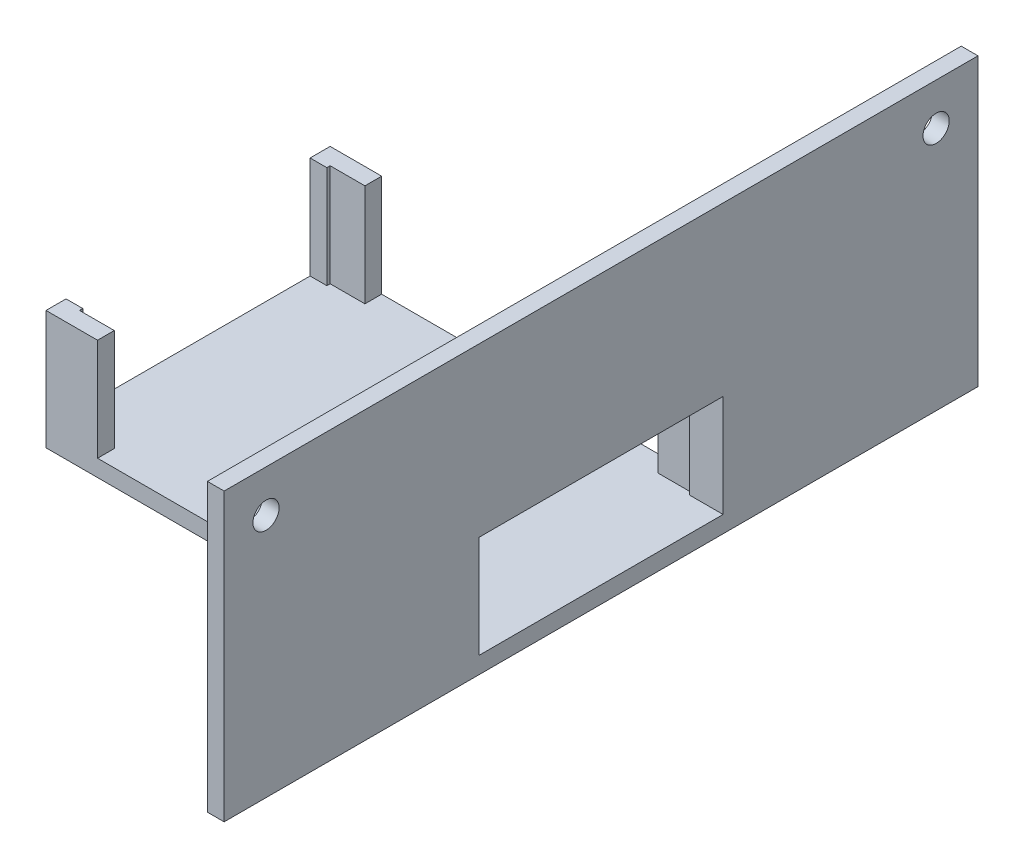
ISO-10303-21;
HEADER;
FILE_DESCRIPTION(('STEP AP214'),'2;1');
FILE_NAME('part.step','',(''),(''),'','','');
FILE_SCHEMA(('AUTOMOTIVE_DESIGN { 1 0 10303 214 1 1 1 1 }'));
ENDSEC;
DATA;
#1=APPLICATION_CONTEXT('core data for automotive mechanical design processes');
#2=APPLICATION_PROTOCOL_DEFINITION('international standard','automotive_design',2000,#1);
#3=PRODUCT_CONTEXT('',#1,'mechanical');
#4=PRODUCT('Part','Part','',(#3));
#5=PRODUCT_RELATED_PRODUCT_CATEGORY('part','',(#4));
#6=PRODUCT_DEFINITION_FORMATION('','',#4);
#7=PRODUCT_DEFINITION_CONTEXT('part definition',#1,'design');
#8=PRODUCT_DEFINITION('design','',#6,#7);
#9=PRODUCT_DEFINITION_SHAPE('','',#8);
#10=(LENGTH_UNIT() NAMED_UNIT(*) SI_UNIT(.MILLI.,.METRE.));
#11=(NAMED_UNIT(*) PLANE_ANGLE_UNIT() SI_UNIT($,.RADIAN.));
#12=(NAMED_UNIT(*) SI_UNIT($,.STERADIAN.) SOLID_ANGLE_UNIT());
#13=UNCERTAINTY_MEASURE_WITH_UNIT(LENGTH_MEASURE(1.E-05),#10,'distance_accuracy_value','');
#14=(GEOMETRIC_REPRESENTATION_CONTEXT(3) GLOBAL_UNCERTAINTY_ASSIGNED_CONTEXT((#13)) GLOBAL_UNIT_ASSIGNED_CONTEXT((#10,
#11,#12)) REPRESENTATION_CONTEXT('',''));
#15=CARTESIAN_POINT('',(0.,0.,0.));
#16=DIRECTION('',(0.,0.,1.));
#17=DIRECTION('',(1.,0.,0.));
#18=AXIS2_PLACEMENT_3D('',#15,#16,#17);
#19=CARTESIAN_POINT('',(0.,18.039999988,0.));
#20=DIRECTION('',(0.,1.,0.));
#21=DIRECTION('',(0.,0.,1.));
#22=AXIS2_PLACEMENT_3D('',#19,#20,#21);
#23=PLANE('',#22);
#24=DIRECTION('',(-1.,0.,0.));
#25=VECTOR('',#24,1.);
#26=CARTESIAN_POINT('',(32.579999991,18.039999988,-40.039999973));
#27=LINE('',#26,#25);
#28=CARTESIAN_POINT('',(-27.499999991,18.039999988,-40.039999973));
#29=VERTEX_POINT('',#28);
#30=CARTESIAN_POINT('',(-30.039999991,18.039999988,-40.039999973));
#31=VERTEX_POINT('',#30);
#32=EDGE_CURVE('E284',#29,#31,#27,.T.);
#33=ORIENTED_EDGE('',*,*,#32,.F.);
#34=DIRECTION('',(0.,0.,1.));
#35=VECTOR('',#34,1.);
#36=CARTESIAN_POINT('',(-27.499999991,18.039999988,-43.079999946));
#37=LINE('',#36,#35);
#38=CARTESIAN_POINT('',(-27.499999991,18.039999988,-40.539999946));
#39=VERTEX_POINT('',#38);
#40=EDGE_CURVE('E450',#39,#29,#37,.T.);
#41=ORIENTED_EDGE('',*,*,#40,.F.);
#42=DIRECTION('',(-1.,0.,0.));
#43=VECTOR('',#42,1.);
#44=CARTESIAN_POINT('',(-30.039999991,18.039999988,-40.539999946));
#45=LINE('',#44,#43);
#46=CARTESIAN_POINT('',(-22.225,18.039999988,-40.539999946));
#47=VERTEX_POINT('',#46);
#48=EDGE_CURVE('E459',#47,#39,#45,.T.);
#49=ORIENTED_EDGE('',*,*,#48,.F.);
#50=DIRECTION('',(0.,0.,1.));
#51=VECTOR('',#50,1.);
#52=CARTESIAN_POINT('',(-22.225,18.039999988,-78.689999973));
#53=LINE('',#52,#51);
#54=CARTESIAN_POINT('',(-22.225,18.039999988,-43.079999946));
#55=VERTEX_POINT('',#54);
#56=EDGE_CURVE('E320',#55,#47,#53,.T.);
#57=ORIENTED_EDGE('',*,*,#56,.F.);
#58=DIRECTION('',(-1.,0.,0.));
#59=VECTOR('',#58,1.);
#60=CARTESIAN_POINT('',(-30.039999991,18.039999988,-43.079999946));
#61=LINE('',#60,#59);
#62=CARTESIAN_POINT('',(-30.039999991,18.039999988,-43.079999946));
#63=VERTEX_POINT('',#62);
#64=EDGE_CURVE('E473',#55,#63,#61,.T.);
#65=ORIENTED_EDGE('',*,*,#64,.T.);
#66=DIRECTION('',(0.,0.,1.));
#67=VECTOR('',#66,1.);
#68=CARTESIAN_POINT('',(-30.039999991,18.039999988,-43.079999946));
#69=LINE('',#68,#67);
#70=EDGE_CURVE('E463',#63,#31,#69,.T.);
#71=ORIENTED_EDGE('',*,*,#70,.T.);
#72=EDGE_LOOP('',(#33,#41,#49,#57,#65,#71));
#73=FACE_BOUND('',#72,.T.);
#74=ADVANCED_FACE('F39',(#73),#23,.T.);
#75=CARTESIAN_POINT('',(-27.499999991,18.039999988,-43.079999946));
#76=DIRECTION('',(1.,0.,0.));
#77=DIRECTION('',(0.,0.,-1.));
#78=AXIS2_PLACEMENT_3D('',#75,#76,#77);
#79=PLANE('',#78);
#80=DIRECTION('',(0.,1.,0.));
#81=VECTOR('',#80,1.);
#82=CARTESIAN_POINT('',(-27.499999991,18.039999988,-40.039999973));
#83=LINE('',#82,#81);
#84=CARTESIAN_POINT('',(-27.499999991,2.54,-40.039999973));
#85=VERTEX_POINT('',#84);
#86=EDGE_CURVE('E302',#85,#29,#83,.T.);
#87=ORIENTED_EDGE('',*,*,#86,.F.);
#88=DIRECTION('',(0.,0.,1.));
#89=VECTOR('',#88,1.);
#90=CARTESIAN_POINT('',(-27.499999991,2.54,-43.079999946));
#91=LINE('',#90,#89);
#92=CARTESIAN_POINT('',(-27.499999991,2.54,-40.539999946));
#93=VERTEX_POINT('',#92);
#94=EDGE_CURVE('E413',#93,#85,#91,.T.);
#95=ORIENTED_EDGE('',*,*,#94,.F.);
#96=DIRECTION('',(0.,-1.,0.));
#97=VECTOR('',#96,1.);
#98=CARTESIAN_POINT('',(-27.499999991,18.039999988,-40.539999946));
#99=LINE('',#98,#97);
#100=EDGE_CURVE('E424',#39,#93,#99,.T.);
#101=ORIENTED_EDGE('',*,*,#100,.F.);
#102=ORIENTED_EDGE('',*,*,#40,.T.);
#103=EDGE_LOOP('',(#87,#95,#101,#102));
#104=FACE_BOUND('',#103,.T.);
#105=ADVANCED_FACE('F555',(#104),#79,.T.);
#106=DIRECTION('',(-1.,0.,0.));
#107=VECTOR('',#106,1.);
#108=CARTESIAN_POINT('',(32.579999991,18.039999988,-3.039999973));
#109=LINE('',#108,#107);
#110=CARTESIAN_POINT('',(-27.499999991,18.039999988,-3.039999973));
#111=VERTEX_POINT('',#110);
#112=CARTESIAN_POINT('',(-30.039999991,18.039999988,-3.039999973));
#113=VERTEX_POINT('',#112);
#114=EDGE_CURVE('E289',#111,#113,#109,.T.);
#115=ORIENTED_EDGE('',*,*,#114,.T.);
#116=CARTESIAN_POINT('',(-30.039999991,18.039999988,0.));
#117=VERTEX_POINT('',#116);
#118=EDGE_CURVE('E468',#113,#117,#69,.T.);
#119=ORIENTED_EDGE('',*,*,#118,.T.);
#120=DIRECTION('',(1.,0.,0.));
#121=VECTOR('',#120,1.);
#122=CARTESIAN_POINT('',(-30.039999991,18.039999988,0.));
#123=LINE('',#122,#121);
#124=CARTESIAN_POINT('',(-22.225,18.039999988,0.));
#125=VERTEX_POINT('',#124);
#126=EDGE_CURVE('E469',#117,#125,#123,.T.);
#127=ORIENTED_EDGE('',*,*,#126,.T.);
#128=CARTESIAN_POINT('',(-22.225,18.039999988,-2.54));
#129=VERTEX_POINT('',#128);
#130=EDGE_CURVE('E317',#129,#125,#53,.T.);
#131=ORIENTED_EDGE('',*,*,#130,.F.);
#132=DIRECTION('',(1.,0.,0.));
#133=VECTOR('',#132,1.);
#134=CARTESIAN_POINT('',(-30.039999991,18.039999988,-2.54));
#135=LINE('',#134,#133);
#136=CARTESIAN_POINT('',(-27.499999991,18.039999988,-2.54));
#137=VERTEX_POINT('',#136);
#138=EDGE_CURVE('E455',#137,#129,#135,.T.);
#139=ORIENTED_EDGE('',*,*,#138,.F.);
#140=EDGE_CURVE('E449',#111,#137,#37,.T.);
#141=ORIENTED_EDGE('',*,*,#140,.F.);
#142=EDGE_LOOP('',(#115,#119,#127,#131,#139,#141));
#143=FACE_BOUND('',#142,.T.);
#144=ADVANCED_FACE('F558',(#143),#23,.T.);
#145=DIRECTION('',(0.,0.,1.));
#146=VECTOR('',#145,1.);
#147=CARTESIAN_POINT('',(22.225,18.039999988,-78.689999973));
#148=LINE('',#147,#146);
#149=CARTESIAN_POINT('',(22.225,18.039999988,-2.54));
#150=VERTEX_POINT('',#149);
#151=CARTESIAN_POINT('',(22.225,18.039999988,0.));
#152=VERTEX_POINT('',#151);
#153=EDGE_CURVE('E322',#150,#152,#148,.T.);
#154=ORIENTED_EDGE('',*,*,#153,.T.);
#155=CARTESIAN_POINT('',(24.959999991,18.039999988,0.));
#156=VERTEX_POINT('',#155);
#157=EDGE_CURVE('E467',#152,#156,#123,.T.);
#158=ORIENTED_EDGE('',*,*,#157,.T.);
#159=DIRECTION('',(0.,0.,-1.));
#160=VECTOR('',#159,1.);
#161=CARTESIAN_POINT('',(24.959999991,18.039999988,0.));
#162=LINE('',#161,#160);
#163=CARTESIAN_POINT('',(24.959999991,18.039999988,-2.54));
#164=VERTEX_POINT('',#163);
#165=EDGE_CURVE('E505',#156,#164,#162,.T.);
#166=ORIENTED_EDGE('',*,*,#165,.T.);
#167=EDGE_CURVE('E454',#150,#164,#135,.T.);
#168=ORIENTED_EDGE('',*,*,#167,.F.);
#169=EDGE_LOOP('',(#154,#158,#166,#168));
#170=FACE_BOUND('',#169,.T.);
#171=ADVANCED_FACE('F570',(#170),#23,.T.);
#172=CARTESIAN_POINT('',(-30.039999991,18.039999988,-2.54));
#173=DIRECTION('',(0.,0.,-1.));
#174=DIRECTION('',(-1.,0.,0.));
#175=AXIS2_PLACEMENT_3D('',#172,#173,#174);
#176=PLANE('',#175);
#177=DIRECTION('',(0.,1.,0.));
#178=VECTOR('',#177,1.);
#179=CARTESIAN_POINT('',(-22.225,18.039999988,-2.54));
#180=LINE('',#179,#178);
#181=CARTESIAN_POINT('',(-22.225,2.53999999999999,-2.54));
#182=VERTEX_POINT('',#181);
#183=EDGE_CURVE('E348',#182,#129,#180,.T.);
#184=ORIENTED_EDGE('',*,*,#183,.F.);
#185=DIRECTION('',(1.,0.,0.));
#186=VECTOR('',#185,1.);
#187=CARTESIAN_POINT('',(-30.039999991,2.54,-2.54));
#188=LINE('',#187,#186);
#189=CARTESIAN_POINT('',(-27.499999991,2.54,-2.54));
#190=VERTEX_POINT('',#189);
#191=EDGE_CURVE('E430',#190,#182,#188,.T.);
#192=ORIENTED_EDGE('',*,*,#191,.F.);
#193=DIRECTION('',(0.,-1.,0.));
#194=VECTOR('',#193,1.);
#195=CARTESIAN_POINT('',(-27.499999991,18.039999988,-2.54));
#196=LINE('',#195,#194);
#197=EDGE_CURVE('E418',#137,#190,#196,.T.);
#198=ORIENTED_EDGE('',*,*,#197,.F.);
#199=ORIENTED_EDGE('',*,*,#138,.T.);
#200=EDGE_LOOP('',(#184,#192,#198,#199));
#201=FACE_BOUND('',#200,.T.);
#202=ADVANCED_FACE('F586',(#201),#176,.T.);
#203=CARTESIAN_POINT('',(-30.039999991,18.039999988,-40.539999946));
#204=DIRECTION('',(0.,0.,1.));
#205=DIRECTION('',(1.,0.,0.));
#206=AXIS2_PLACEMENT_3D('',#203,#204,#205);
#207=PLANE('',#206);
#208=DIRECTION('',(0.,-1.,0.));
#209=VECTOR('',#208,1.);
#210=CARTESIAN_POINT('',(-22.225,18.039999988,-40.539999946));
#211=LINE('',#210,#209);
#212=CARTESIAN_POINT('',(-22.225,2.54,-40.539999946));
#213=VERTEX_POINT('',#212);
#214=EDGE_CURVE('E344',#47,#213,#211,.T.);
#215=ORIENTED_EDGE('',*,*,#214,.F.);
#216=ORIENTED_EDGE('',*,*,#48,.T.);
#217=ORIENTED_EDGE('',*,*,#100,.T.);
#218=DIRECTION('',(-1.,0.,0.));
#219=VECTOR('',#218,1.);
#220=CARTESIAN_POINT('',(-30.039999991,2.54,-40.539999946));
#221=LINE('',#220,#219);
#222=EDGE_CURVE('E441',#213,#93,#221,.T.);
#223=ORIENTED_EDGE('',*,*,#222,.F.);
#224=EDGE_LOOP('',(#215,#216,#217,#223));
#225=FACE_BOUND('',#224,.T.);
#226=ADVANCED_FACE('F591',(#225),#207,.T.);
#227=CARTESIAN_POINT('',(-30.039999991,18.039999988,-43.079999946));
#228=DIRECTION('',(1.,0.,0.));
#229=DIRECTION('',(0.,0.,-1.));
#230=AXIS2_PLACEMENT_3D('',#227,#228,#229);
#231=PLANE('',#230);
#232=DIRECTION('',(0.,0.,1.));
#233=VECTOR('',#232,1.);
#234=CARTESIAN_POINT('',(-30.039999991,2.54,-3.039999973));
#235=LINE('',#234,#233);
#236=CARTESIAN_POINT('',(-30.039999991,2.54,-40.039999973));
#237=VERTEX_POINT('',#236);
#238=CARTESIAN_POINT('',(-30.039999991,2.54,-3.039999973));
#239=VERTEX_POINT('',#238);
#240=EDGE_CURVE('E267',#237,#239,#235,.T.);
#241=ORIENTED_EDGE('',*,*,#240,.F.);
#242=DIRECTION('',(0.,-1.,0.));
#243=VECTOR('',#242,1.);
#244=CARTESIAN_POINT('',(-30.039999991,2.54,-40.039999973));
#245=LINE('',#244,#243);
#246=EDGE_CURVE('E274',#31,#237,#245,.T.);
#247=ORIENTED_EDGE('',*,*,#246,.F.);
#248=ORIENTED_EDGE('',*,*,#70,.F.);
#249=DIRECTION('',(0.,-1.,0.));
#250=VECTOR('',#249,1.);
#251=CARTESIAN_POINT('',(-30.039999991,18.039999988,-43.079999946));
#252=LINE('',#251,#250);
#253=CARTESIAN_POINT('',(-30.039999991,0.,-43.079999946));
#254=VERTEX_POINT('',#253);
#255=EDGE_CURVE('E478',#63,#254,#252,.T.);
#256=ORIENTED_EDGE('',*,*,#255,.T.);
#257=DIRECTION('',(0.,0.,1.));
#258=VECTOR('',#257,1.);
#259=CARTESIAN_POINT('',(-30.039999991,0.,-43.079999946));
#260=LINE('',#259,#258);
#261=CARTESIAN_POINT('',(-30.039999991,0.,0.));
#262=VERTEX_POINT('',#261);
#263=EDGE_CURVE('E422',#254,#262,#260,.T.);
#264=ORIENTED_EDGE('',*,*,#263,.T.);
#265=DIRECTION('',(0.,-1.,0.));
#266=VECTOR('',#265,1.);
#267=CARTESIAN_POINT('',(-30.039999991,18.039999988,0.));
#268=LINE('',#267,#266);
#269=EDGE_CURVE('E498',#117,#262,#268,.T.);
#270=ORIENTED_EDGE('',*,*,#269,.F.);
#271=ORIENTED_EDGE('',*,*,#118,.F.);
#272=DIRECTION('',(0.,1.,0.));
#273=VECTOR('',#272,1.);
#274=CARTESIAN_POINT('',(-30.039999991,2.54,-3.039999973));
#275=LINE('',#274,#273);
#276=EDGE_CURVE('E264',#239,#113,#275,.T.);
#277=ORIENTED_EDGE('',*,*,#276,.F.);
#278=EDGE_LOOP('',(#241,#247,#248,#256,#264,#270,#271,#277));
#279=FACE_BOUND('',#278,.T.);
#280=ADVANCED_FACE('F640',(#279),#231,.F.);
#281=CARTESIAN_POINT('',(-30.039999991,18.039999988,0.));
#282=DIRECTION('',(0.,0.,-1.));
#283=DIRECTION('',(-1.,0.,0.));
#284=AXIS2_PLACEMENT_3D('',#281,#282,#283);
#285=PLANE('',#284);
#286=DIRECTION('',(1.,0.,0.));
#287=VECTOR('',#286,1.);
#288=CARTESIAN_POINT('',(22.225,2.54,0.));
#289=LINE('',#288,#287);
#290=CARTESIAN_POINT('',(-22.225,2.53999999999999,0.));
#291=VERTEX_POINT('',#290);
#292=CARTESIAN_POINT('',(22.225,2.54,0.));
#293=VERTEX_POINT('',#292);
#294=EDGE_CURVE('E309',#291,#293,#289,.T.);
#295=ORIENTED_EDGE('',*,*,#294,.F.);
#296=DIRECTION('',(0.,-1.,0.));
#297=VECTOR('',#296,1.);
#298=CARTESIAN_POINT('',(-22.225,2.53999999999999,0.));
#299=LINE('',#298,#297);
#300=EDGE_CURVE('E305',#125,#291,#299,.T.);
#301=ORIENTED_EDGE('',*,*,#300,.F.);
#302=ORIENTED_EDGE('',*,*,#126,.F.);
#303=ORIENTED_EDGE('',*,*,#269,.T.);
#304=DIRECTION('',(1.,0.,0.));
#305=VECTOR('',#304,1.);
#306=CARTESIAN_POINT('',(-30.039999991,0.,0.));
#307=LINE('',#306,#305);
#308=CARTESIAN_POINT('',(30.039999991,0.,0.));
#309=VERTEX_POINT('',#308);
#310=EDGE_CURVE('E482',#262,#309,#307,.T.);
#311=ORIENTED_EDGE('',*,*,#310,.T.);
#312=DIRECTION('',(0.,-1.,0.));
#313=VECTOR('',#312,1.);
#314=CARTESIAN_POINT('',(30.039999991,18.039999988,0.));
#315=LINE('',#314,#313);
#316=CARTESIAN_POINT('',(30.039999991,23.119999988,0.));
#317=VERTEX_POINT('',#316);
#318=EDGE_CURVE('E494',#317,#309,#315,.T.);
#319=ORIENTED_EDGE('',*,*,#318,.F.);
#320=CARTESIAN_POINT('',(24.959999991,23.119999988,0.));
#321=DIRECTION('',(0.,0.,-1.));
#322=DIRECTION('',(-1.,0.,0.));
#323=AXIS2_PLACEMENT_3D('',#320,#321,#322);
#324=CIRCLE('',#323,5.08);
#325=EDGE_CURVE('E11',#317,#156,#324,.T.);
#326=ORIENTED_EDGE('',*,*,#325,.T.);
#327=ORIENTED_EDGE('',*,*,#157,.F.);
#328=DIRECTION('',(0.,1.,0.));
#329=VECTOR('',#328,1.);
#330=CARTESIAN_POINT('',(22.225,2.54,0.));
#331=LINE('',#330,#329);
#332=EDGE_CURVE('E313',#293,#152,#331,.T.);
#333=ORIENTED_EDGE('',*,*,#332,.F.);
#334=EDGE_LOOP('',(#295,#301,#302,#303,#311,#319,#326,#327,#333));
#335=FACE_BOUND('',#334,.T.);
#336=ADVANCED_FACE('F581',(#335),#285,.F.);
#337=CARTESIAN_POINT('',(-30.039999991,18.039999988,-43.079999946));
#338=DIRECTION('',(0.,0.,1.));
#339=DIRECTION('',(1.,0.,0.));
#340=AXIS2_PLACEMENT_3D('',#337,#338,#339);
#341=PLANE('',#340);
#342=ORIENTED_EDGE('',*,*,#64,.F.);
#343=DIRECTION('',(0.,-1.,0.));
#344=VECTOR('',#343,1.);
#345=CARTESIAN_POINT('',(-22.225,18.039999988,-43.079999946));
#346=LINE('',#345,#344);
#347=CARTESIAN_POINT('',(-22.225,2.53999999999999,-43.079999946));
#348=VERTEX_POINT('',#347);
#349=EDGE_CURVE('E351',#55,#348,#346,.T.);
#350=ORIENTED_EDGE('',*,*,#349,.T.);
#351=DIRECTION('',(1.,0.,0.));
#352=VECTOR('',#351,1.);
#353=CARTESIAN_POINT('',(-30.039999991,2.53999999999999,-43.079999946));
#354=LINE('',#353,#352);
#355=CARTESIAN_POINT('',(22.225,2.54,-43.079999946));
#356=VERTEX_POINT('',#355);
#357=EDGE_CURVE('E355',#348,#356,#354,.T.);
#358=ORIENTED_EDGE('',*,*,#357,.T.);
#359=DIRECTION('',(0.,1.,0.));
#360=VECTOR('',#359,1.);
#361=CARTESIAN_POINT('',(22.225,18.039999988,-43.079999946));
#362=LINE('',#361,#360);
#363=CARTESIAN_POINT('',(22.225,18.039999988,-43.079999946));
#364=VERTEX_POINT('',#363);
#365=EDGE_CURVE('E340',#356,#364,#362,.T.);
#366=ORIENTED_EDGE('',*,*,#365,.T.);
#367=CARTESIAN_POINT('',(24.959999991,18.039999988,-43.079999946));
#368=VERTEX_POINT('',#367);
#369=EDGE_CURVE('E474',#368,#364,#61,.T.);
#370=ORIENTED_EDGE('',*,*,#369,.F.);
#371=CARTESIAN_POINT('',(24.959999991,23.119999988,-43.079999946));
#372=DIRECTION('',(0.,0.,1.));
#373=DIRECTION('',(1.,0.,0.));
#374=AXIS2_PLACEMENT_3D('',#371,#372,#373);
#375=CIRCLE('',#374,5.08);
#376=CARTESIAN_POINT('',(30.039999991,23.119999988,-43.079999946));
#377=VERTEX_POINT('',#376);
#378=EDGE_CURVE('E49',#368,#377,#375,.T.);
#379=ORIENTED_EDGE('',*,*,#378,.T.);
#380=DIRECTION('',(0.,-1.,0.));
#381=VECTOR('',#380,1.);
#382=CARTESIAN_POINT('',(30.039999991,18.039999988,-43.079999946));
#383=LINE('',#382,#381);
#384=CARTESIAN_POINT('',(30.039999991,0.,-43.079999946));
#385=VERTEX_POINT('',#384);
#386=EDGE_CURVE('E491',#377,#385,#383,.T.);
#387=ORIENTED_EDGE('',*,*,#386,.T.);
#388=DIRECTION('',(-1.,0.,0.));
#389=VECTOR('',#388,1.);
#390=CARTESIAN_POINT('',(-30.039999991,0.,-43.079999946));
#391=LINE('',#390,#389);
#392=EDGE_CURVE('E485',#385,#254,#391,.T.);
#393=ORIENTED_EDGE('',*,*,#392,.T.);
#394=ORIENTED_EDGE('',*,*,#255,.F.);
#395=EDGE_LOOP('',(#342,#350,#358,#366,#370,#379,#387,#393,#394));
#396=FACE_BOUND('',#395,.T.);
#397=ADVANCED_FACE('F574',(#396),#341,.F.);
#398=CARTESIAN_POINT('',(22.225,18.039999988,-40.539999946));
#399=VERTEX_POINT('',#398);
#400=EDGE_CURVE('E321',#364,#399,#148,.T.);
#401=ORIENTED_EDGE('',*,*,#400,.T.);
#402=CARTESIAN_POINT('',(24.959999991,18.039999988,-40.539999946));
#403=VERTEX_POINT('',#402);
#404=EDGE_CURVE('E429',#403,#399,#45,.T.);
#405=ORIENTED_EDGE('',*,*,#404,.F.);
#406=DIRECTION('',(0.,0.,-1.));
#407=VECTOR('',#406,1.);
#408=CARTESIAN_POINT('',(24.959999991,18.039999988,0.));
#409=LINE('',#408,#407);
#410=EDGE_CURVE('E502',#403,#368,#409,.T.);
#411=ORIENTED_EDGE('',*,*,#410,.T.);
#412=ORIENTED_EDGE('',*,*,#369,.T.);
#413=EDGE_LOOP('',(#401,#405,#411,#412));
#414=FACE_BOUND('',#413,.T.);
#415=ADVANCED_FACE('F559',(#414),#23,.T.);
#416=CARTESIAN_POINT('',(0.,0.,0.));
#417=DIRECTION('',(0.,1.,0.));
#418=DIRECTION('',(0.,0.,1.));
#419=AXIS2_PLACEMENT_3D('',#416,#417,#418);
#420=PLANE('',#419);
#421=ORIENTED_EDGE('',*,*,#263,.F.);
#422=ORIENTED_EDGE('',*,*,#392,.F.);
#423=DIRECTION('',(0.,0.,-1.));
#424=VECTOR('',#423,1.);
#425=CARTESIAN_POINT('',(30.039999991,0.,-78.689999973));
#426=LINE('',#425,#424);
#427=CARTESIAN_POINT('',(30.039999991,0.,-78.689999973));
#428=VERTEX_POINT('',#427);
#429=EDGE_CURVE('E393',#385,#428,#426,.T.);
#430=ORIENTED_EDGE('',*,*,#429,.T.);
#431=DIRECTION('',(-1.,0.,0.));
#432=VECTOR('',#431,1.);
#433=CARTESIAN_POINT('',(32.579999991,0.,-78.689999973));
#434=LINE('',#433,#432);
#435=CARTESIAN_POINT('',(32.579999991,0.,-78.689999973));
#436=VERTEX_POINT('',#435);
#437=EDGE_CURVE('E382',#436,#428,#434,.T.);
#438=ORIENTED_EDGE('',*,*,#437,.F.);
#439=DIRECTION('',(0.,0.,-1.));
#440=VECTOR('',#439,1.);
#441=CARTESIAN_POINT('',(32.579999991,0.,-78.689999973));
#442=LINE('',#441,#440);
#443=CARTESIAN_POINT('',(32.579999991,0.,35.610000027));
#444=VERTEX_POINT('',#443);
#445=EDGE_CURVE('E379',#444,#436,#442,.T.);
#446=ORIENTED_EDGE('',*,*,#445,.F.);
#447=DIRECTION('',(-1.,0.,0.));
#448=VECTOR('',#447,1.);
#449=CARTESIAN_POINT('',(32.579999991,0.,35.610000027));
#450=LINE('',#449,#448);
#451=CARTESIAN_POINT('',(30.039999991,0.,35.610000027));
#452=VERTEX_POINT('',#451);
#453=EDGE_CURVE('E400',#444,#452,#450,.T.);
#454=ORIENTED_EDGE('',*,*,#453,.T.);
#455=EDGE_CURVE('E373',#452,#309,#426,.T.);
#456=ORIENTED_EDGE('',*,*,#455,.T.);
#457=ORIENTED_EDGE('',*,*,#310,.F.);
#458=EDGE_LOOP('',(#421,#422,#430,#438,#446,#454,#456,#457));
#459=FACE_BOUND('',#458,.T.);
#460=ADVANCED_FACE('F573',(#459),#420,.F.);
#461=DIRECTION('',(0.,-1.,0.));
#462=VECTOR('',#461,1.);
#463=CARTESIAN_POINT('',(-27.499999991,18.039999988,-3.039999973));
#464=LINE('',#463,#462);
#465=CARTESIAN_POINT('',(-27.499999991,2.54,-3.039999973));
#466=VERTEX_POINT('',#465);
#467=EDGE_CURVE('E294',#111,#466,#464,.T.);
#468=ORIENTED_EDGE('',*,*,#467,.F.);
#469=ORIENTED_EDGE('',*,*,#140,.T.);
#470=ORIENTED_EDGE('',*,*,#197,.T.);
#471=EDGE_CURVE('E412',#466,#190,#91,.T.);
#472=ORIENTED_EDGE('',*,*,#471,.F.);
#473=EDGE_LOOP('',(#468,#469,#470,#472));
#474=FACE_BOUND('',#473,.T.);
#475=ADVANCED_FACE('F565',(#474),#79,.T.);
#476=DIRECTION('',(0.,-1.,0.));
#477=VECTOR('',#476,1.);
#478=CARTESIAN_POINT('',(22.225,18.039999988,-2.54));
#479=LINE('',#478,#477);
#480=CARTESIAN_POINT('',(22.225,2.54,-2.54));
#481=VERTEX_POINT('',#480);
#482=EDGE_CURVE('E336',#150,#481,#479,.T.);
#483=ORIENTED_EDGE('',*,*,#482,.F.);
#484=ORIENTED_EDGE('',*,*,#167,.T.);
#485=CARTESIAN_POINT('',(24.959999991,23.119999988,-2.54));
#486=DIRECTION('',(0.,0.,-1.));
#487=DIRECTION('',(-1.,0.,0.));
#488=AXIS2_PLACEMENT_3D('',#485,#486,#487);
#489=CIRCLE('',#488,5.08);
#490=CARTESIAN_POINT('',(27.499999991,18.7205909367751,-2.54));
#491=VERTEX_POINT('',#490);
#492=EDGE_CURVE('E513',#164,#491,#489,.F.);
#493=ORIENTED_EDGE('',*,*,#492,.T.);
#494=DIRECTION('',(0.,-1.,0.));
#495=VECTOR('',#494,1.);
#496=CARTESIAN_POINT('',(27.499999991,18.039999988,-2.54));
#497=LINE('',#496,#495);
#498=CARTESIAN_POINT('',(27.499999991,2.54,-2.54));
#499=VERTEX_POINT('',#498);
#500=EDGE_CURVE('E423',#491,#499,#497,.T.);
#501=ORIENTED_EDGE('',*,*,#500,.T.);
#502=EDGE_CURVE('E417',#481,#499,#188,.T.);
#503=ORIENTED_EDGE('',*,*,#502,.F.);
#504=EDGE_LOOP('',(#483,#484,#493,#501,#503));
#505=FACE_BOUND('',#504,.T.);
#506=ADVANCED_FACE('F594',(#505),#176,.T.);
#507=CARTESIAN_POINT('',(27.499999991,18.039999988,-43.079999946));
#508=DIRECTION('',(-1.,0.,0.));
#509=DIRECTION('',(0.,0.,1.));
#510=AXIS2_PLACEMENT_3D('',#507,#508,#509);
#511=PLANE('',#510);
#512=DIRECTION('',(0.,-1.,0.));
#513=VECTOR('',#512,1.);
#514=CARTESIAN_POINT('',(27.499999991,18.039999988,-40.039999973));
#515=LINE('',#514,#513);
#516=CARTESIAN_POINT('',(27.499999991,18.039999988,-40.039999973));
#517=VERTEX_POINT('',#516);
#518=CARTESIAN_POINT('',(27.499999991,2.54,-40.039999973));
#519=VERTEX_POINT('',#518);
#520=EDGE_CURVE('E243',#517,#519,#515,.T.);
#521=ORIENTED_EDGE('',*,*,#520,.F.);
#522=DIRECTION('',(0.,0.,-1.));
#523=VECTOR('',#522,1.);
#524=CARTESIAN_POINT('',(27.499999991,18.039999988,-43.079999946));
#525=LINE('',#524,#523);
#526=CARTESIAN_POINT('',(27.499999991,18.039999988,-3.039999973));
#527=VERTEX_POINT('',#526);
#528=EDGE_CURVE('E297',#527,#517,#525,.T.);
#529=ORIENTED_EDGE('',*,*,#528,.F.);
#530=DIRECTION('',(0.,1.,0.));
#531=VECTOR('',#530,1.);
#532=CARTESIAN_POINT('',(27.499999991,18.039999988,-3.039999973));
#533=LINE('',#532,#531);
#534=CARTESIAN_POINT('',(27.499999991,2.54,-3.039999973));
#535=VERTEX_POINT('',#534);
#536=EDGE_CURVE('E283',#535,#527,#533,.T.);
#537=ORIENTED_EDGE('',*,*,#536,.F.);
#538=DIRECTION('',(0.,0.,-1.));
#539=VECTOR('',#538,1.);
#540=CARTESIAN_POINT('',(27.499999991,2.54,-43.079999946));
#541=LINE('',#540,#539);
#542=EDGE_CURVE('E438',#499,#535,#541,.T.);
#543=ORIENTED_EDGE('',*,*,#542,.F.);
#544=ORIENTED_EDGE('',*,*,#500,.F.);
#545=DIRECTION('',(0.,0.,-1.));
#546=VECTOR('',#545,1.);
#547=CARTESIAN_POINT('',(27.499999991,18.7205909367751,-2.54));
#548=LINE('',#547,#546);
#549=CARTESIAN_POINT('',(27.499999991,18.7205909367751,-40.539999946));
#550=VERTEX_POINT('',#549);
#551=EDGE_CURVE('E517',#491,#550,#548,.T.);
#552=ORIENTED_EDGE('',*,*,#551,.T.);
#553=DIRECTION('',(0.,-1.,0.));
#554=VECTOR('',#553,1.);
#555=CARTESIAN_POINT('',(27.499999991,18.039999988,-40.539999946));
#556=LINE('',#555,#554);
#557=CARTESIAN_POINT('',(27.499999991,2.54,-40.539999946));
#558=VERTEX_POINT('',#557);
#559=EDGE_CURVE('E428',#550,#558,#556,.T.);
#560=ORIENTED_EDGE('',*,*,#559,.T.);
#561=EDGE_CURVE('E434',#519,#558,#541,.T.);
#562=ORIENTED_EDGE('',*,*,#561,.F.);
#563=EDGE_LOOP('',(#521,#529,#537,#543,#544,#552,#560,#562));
#564=FACE_BOUND('',#563,.T.);
#565=ADVANCED_FACE('F697',(#564),#511,.T.);
#566=DIRECTION('',(0.,1.,0.));
#567=VECTOR('',#566,1.);
#568=CARTESIAN_POINT('',(22.225,18.039999988,-40.539999946));
#569=LINE('',#568,#567);
#570=CARTESIAN_POINT('',(22.225,2.54,-40.539999946));
#571=VERTEX_POINT('',#570);
#572=EDGE_CURVE('E333',#571,#399,#569,.T.);
#573=ORIENTED_EDGE('',*,*,#572,.F.);
#574=EDGE_CURVE('E445',#558,#571,#221,.T.);
#575=ORIENTED_EDGE('',*,*,#574,.F.);
#576=ORIENTED_EDGE('',*,*,#559,.F.);
#577=CARTESIAN_POINT('',(24.959999991,23.119999988,-40.539999946));
#578=DIRECTION('',(0.,0.,1.));
#579=DIRECTION('',(1.,0.,0.));
#580=AXIS2_PLACEMENT_3D('',#577,#578,#579);
#581=CIRCLE('',#580,5.08);
#582=EDGE_CURVE('E521',#550,#403,#581,.F.);
#583=ORIENTED_EDGE('',*,*,#582,.T.);
#584=ORIENTED_EDGE('',*,*,#404,.T.);
#585=EDGE_LOOP('',(#573,#575,#576,#583,#584));
#586=FACE_BOUND('',#585,.T.);
#587=ADVANCED_FACE('F691',(#586),#207,.T.);
#588=CARTESIAN_POINT('',(0.,2.54,0.));
#589=DIRECTION('',(0.,1.,0.));
#590=DIRECTION('',(0.,0.,1.));
#591=AXIS2_PLACEMENT_3D('',#588,#589,#590);
#592=PLANE('',#591);
#593=ORIENTED_EDGE('',*,*,#542,.T.);
#594=DIRECTION('',(-1.,0.,0.));
#595=VECTOR('',#594,1.);
#596=CARTESIAN_POINT('',(32.579999991,2.54,-3.039999973));
#597=LINE('',#596,#595);
#598=CARTESIAN_POINT('',(32.579999991,2.54,-3.039999973));
#599=VERTEX_POINT('',#598);
#600=EDGE_CURVE('E253',#599,#535,#597,.T.);
#601=ORIENTED_EDGE('',*,*,#600,.F.);
#602=DIRECTION('',(0.,0.,1.));
#603=VECTOR('',#602,1.);
#604=CARTESIAN_POINT('',(32.579999991,2.54,-3.039999973));
#605=LINE('',#604,#603);
#606=CARTESIAN_POINT('',(32.579999991,2.54,-40.039999973));
#607=VERTEX_POINT('',#606);
#608=EDGE_CURVE('E250',#607,#599,#605,.T.);
#609=ORIENTED_EDGE('',*,*,#608,.F.);
#610=DIRECTION('',(-1.,0.,0.));
#611=VECTOR('',#610,1.);
#612=CARTESIAN_POINT('',(32.579999991,2.54,-40.039999973));
#613=LINE('',#612,#611);
#614=EDGE_CURVE('E57',#607,#519,#613,.T.);
#615=ORIENTED_EDGE('',*,*,#614,.T.);
#616=ORIENTED_EDGE('',*,*,#561,.T.);
#617=ORIENTED_EDGE('',*,*,#574,.T.);
#618=DIRECTION('',(0.,0.,1.));
#619=VECTOR('',#618,1.);
#620=CARTESIAN_POINT('',(22.225,2.54,-78.689999973));
#621=LINE('',#620,#619);
#622=EDGE_CURVE('E326',#356,#571,#621,.T.);
#623=ORIENTED_EDGE('',*,*,#622,.F.);
#624=ORIENTED_EDGE('',*,*,#357,.F.);
#625=DIRECTION('',(0.,0.,1.));
#626=VECTOR('',#625,1.);
#627=CARTESIAN_POINT('',(-22.225,2.53999999999999,-78.689999973));
#628=LINE('',#627,#626);
#629=EDGE_CURVE('E330',#348,#213,#628,.T.);
#630=ORIENTED_EDGE('',*,*,#629,.T.);
#631=ORIENTED_EDGE('',*,*,#222,.T.);
#632=ORIENTED_EDGE('',*,*,#94,.T.);
#633=EDGE_CURVE('E246',#85,#237,#613,.T.);
#634=ORIENTED_EDGE('',*,*,#633,.T.);
#635=ORIENTED_EDGE('',*,*,#240,.T.);
#636=EDGE_CURVE('E64',#466,#239,#597,.T.);
#637=ORIENTED_EDGE('',*,*,#636,.F.);
#638=ORIENTED_EDGE('',*,*,#471,.T.);
#639=ORIENTED_EDGE('',*,*,#191,.T.);
#640=EDGE_CURVE('E316',#182,#291,#628,.T.);
#641=ORIENTED_EDGE('',*,*,#640,.T.);
#642=ORIENTED_EDGE('',*,*,#294,.T.);
#643=EDGE_CURVE('E327',#481,#293,#621,.T.);
#644=ORIENTED_EDGE('',*,*,#643,.F.);
#645=ORIENTED_EDGE('',*,*,#502,.T.);
#646=EDGE_LOOP('',(#593,#601,#609,#615,#616,#617,#623,#624,#630,#631,#632,#634,#635,#637,#638,
#639,#641,#642,#644,#645));
#647=FACE_BOUND('',#646,.T.);
#648=ADVANCED_FACE('F252',(#647),#592,.T.);
#649=CARTESIAN_POINT('',(32.579999991,0.,-78.689999973));
#650=DIRECTION('',(0.,0.,1.));
#651=DIRECTION('',(1.,0.,0.));
#652=AXIS2_PLACEMENT_3D('',#649,#650,#651);
#653=PLANE('',#652);
#654=DIRECTION('',(0.,1.,0.));
#655=VECTOR('',#654,1.);
#656=CARTESIAN_POINT('',(30.039999991,0.,-78.689999973));
#657=LINE('',#656,#655);
#658=CARTESIAN_POINT('',(30.039999991,43.439999988,-78.689999973));
#659=VERTEX_POINT('',#658);
#660=EDGE_CURVE('E383',#428,#659,#657,.T.);
#661=ORIENTED_EDGE('',*,*,#660,.T.);
#662=DIRECTION('',(-1.,0.,0.));
#663=VECTOR('',#662,1.);
#664=CARTESIAN_POINT('',(32.579999991,43.439999988,-78.689999973));
#665=LINE('',#664,#663);
#666=CARTESIAN_POINT('',(32.579999991,43.439999988,-78.689999973));
#667=VERTEX_POINT('',#666);
#668=EDGE_CURVE('E408',#667,#659,#665,.T.);
#669=ORIENTED_EDGE('',*,*,#668,.F.);
#670=DIRECTION('',(0.,1.,0.));
#671=VECTOR('',#670,1.);
#672=CARTESIAN_POINT('',(32.579999991,0.,-78.689999973));
#673=LINE('',#672,#671);
#674=EDGE_CURVE('E368',#436,#667,#673,.T.);
#675=ORIENTED_EDGE('',*,*,#674,.F.);
#676=ORIENTED_EDGE('',*,*,#437,.T.);
#677=EDGE_LOOP('',(#661,#669,#675,#676));
#678=FACE_BOUND('',#677,.T.);
#679=ADVANCED_FACE('F624',(#678),#653,.F.);
#680=CARTESIAN_POINT('',(32.579999991,43.439999988,-78.689999973));
#681=DIRECTION('',(0.,-1.,0.));
#682=DIRECTION('',(0.,0.,-1.));
#683=AXIS2_PLACEMENT_3D('',#680,#681,#682);
#684=PLANE('',#683);
#685=DIRECTION('',(0.,0.,1.));
#686=VECTOR('',#685,1.);
#687=CARTESIAN_POINT('',(30.039999991,43.439999988,-78.689999973));
#688=LINE('',#687,#686);
#689=CARTESIAN_POINT('',(30.039999991,43.439999988,35.610000027));
#690=VERTEX_POINT('',#689);
#691=EDGE_CURVE('E387',#659,#690,#688,.T.);
#692=ORIENTED_EDGE('',*,*,#691,.T.);
#693=DIRECTION('',(-1.,0.,0.));
#694=VECTOR('',#693,1.);
#695=CARTESIAN_POINT('',(32.579999991,43.439999988,35.610000027));
#696=LINE('',#695,#694);
#697=CARTESIAN_POINT('',(32.579999991,43.439999988,35.610000027));
#698=VERTEX_POINT('',#697);
#699=EDGE_CURVE('E404',#698,#690,#696,.T.);
#700=ORIENTED_EDGE('',*,*,#699,.F.);
#701=DIRECTION('',(0.,0.,1.));
#702=VECTOR('',#701,1.);
#703=CARTESIAN_POINT('',(32.579999991,43.439999988,-78.689999973));
#704=LINE('',#703,#702);
#705=EDGE_CURVE('E372',#667,#698,#704,.T.);
#706=ORIENTED_EDGE('',*,*,#705,.F.);
#707=ORIENTED_EDGE('',*,*,#668,.T.);
#708=EDGE_LOOP('',(#692,#700,#706,#707));
#709=FACE_BOUND('',#708,.T.);
#710=ADVANCED_FACE('F630',(#709),#684,.F.);
#711=CARTESIAN_POINT('',(32.579999991,0.,35.610000027));
#712=DIRECTION('',(0.,0.,-1.));
#713=DIRECTION('',(0.,1.,0.));
#714=AXIS2_PLACEMENT_3D('',#711,#712,#713);
#715=PLANE('',#714);
#716=DIRECTION('',(0.,-1.,0.));
#717=VECTOR('',#716,1.);
#718=CARTESIAN_POINT('',(30.039999991,0.,35.610000027));
#719=LINE('',#718,#717);
#720=EDGE_CURVE('E390',#690,#452,#719,.T.);
#721=ORIENTED_EDGE('',*,*,#720,.T.);
#722=ORIENTED_EDGE('',*,*,#453,.F.);
#723=DIRECTION('',(0.,-1.,0.));
#724=VECTOR('',#723,1.);
#725=CARTESIAN_POINT('',(32.579999991,0.,35.610000027));
#726=LINE('',#725,#724);
#727=EDGE_CURVE('E376',#698,#444,#726,.T.);
#728=ORIENTED_EDGE('',*,*,#727,.F.);
#729=ORIENTED_EDGE('',*,*,#699,.T.);
#730=EDGE_LOOP('',(#721,#722,#728,#729));
#731=FACE_BOUND('',#730,.T.);
#732=ADVANCED_FACE('F742',(#731),#715,.F.);
#733=CARTESIAN_POINT('',(32.579999991,0.,0.));
#734=DIRECTION('',(1.,0.,0.));
#735=DIRECTION('',(0.,0.,-1.));
#736=AXIS2_PLACEMENT_3D('',#733,#734,#735);
#737=PLANE('',#736);
#738=DIRECTION('',(0.,-1.,0.));
#739=VECTOR('',#738,1.);
#740=CARTESIAN_POINT('',(32.579999991,2.54,-40.039999973));
#741=LINE('',#740,#739);
#742=CARTESIAN_POINT('',(32.579999991,18.039999988,-40.039999973));
#743=VERTEX_POINT('',#742);
#744=EDGE_CURVE('E240',#743,#607,#741,.T.);
#745=ORIENTED_EDGE('',*,*,#744,.T.);
#746=ORIENTED_EDGE('',*,*,#608,.T.);
#747=DIRECTION('',(0.,1.,0.));
#748=VECTOR('',#747,1.);
#749=CARTESIAN_POINT('',(32.579999991,2.54,-3.039999973));
#750=LINE('',#749,#748);
#751=CARTESIAN_POINT('',(32.579999991,18.039999988,-3.039999973));
#752=VERTEX_POINT('',#751);
#753=EDGE_CURVE('E257',#599,#752,#750,.T.);
#754=ORIENTED_EDGE('',*,*,#753,.T.);
#755=DIRECTION('',(0.,0.,-1.));
#756=VECTOR('',#755,1.);
#757=CARTESIAN_POINT('',(32.579999991,18.039999988,-3.039999973));
#758=LINE('',#757,#756);
#759=EDGE_CURVE('E262',#752,#743,#758,.T.);
#760=ORIENTED_EDGE('',*,*,#759,.T.);
#761=EDGE_LOOP('',(#745,#746,#754,#760));
#762=FACE_BOUND('',#761,.T.);
#763=CARTESIAN_POINT('',(32.579999991,37.089999988,-72.339999973));
#764=DIRECTION('',(-1.,0.,0.));
#765=DIRECTION('',(0.,0.,1.));
#766=AXIS2_PLACEMENT_3D('',#763,#764,#765);
#767=CIRCLE('',#766,1.98437499999999);
#768=CARTESIAN_POINT('',(32.579999991,37.089999988,-70.355624973));
#769=VERTEX_POINT('',#768);
#770=EDGE_CURVE('E360',#769,#769,#767,.T.);
#771=ORIENTED_EDGE('',*,*,#770,.T.);
#772=EDGE_LOOP('',(#771));
#773=FACE_BOUND('',#772,.T.);
#774=CARTESIAN_POINT('',(32.579999991,37.089999988,29.260000027));
#775=DIRECTION('',(-1.,0.,0.));
#776=DIRECTION('',(0.,0.,1.));
#777=AXIS2_PLACEMENT_3D('',#774,#775,#776);
#778=CIRCLE('',#777,1.98437499999999);
#779=CARTESIAN_POINT('',(32.579999991,37.089999988,31.244375027));
#780=VERTEX_POINT('',#779);
#781=EDGE_CURVE('E359',#780,#780,#778,.T.);
#782=ORIENTED_EDGE('',*,*,#781,.T.);
#783=EDGE_LOOP('',(#782));
#784=FACE_BOUND('',#783,.T.);
#785=ORIENTED_EDGE('',*,*,#674,.T.);
#786=ORIENTED_EDGE('',*,*,#705,.T.);
#787=ORIENTED_EDGE('',*,*,#727,.T.);
#788=ORIENTED_EDGE('',*,*,#445,.T.);
#789=EDGE_LOOP('',(#785,#786,#787,#788));
#790=FACE_BOUND('',#789,.T.);
#791=ADVANCED_FACE('F259',(#762,#773,#784,#790),#737,.T.);
#792=CARTESIAN_POINT('',(30.039999991,0.,0.));
#793=DIRECTION('',(1.,0.,0.));
#794=DIRECTION('',(0.,0.,-1.));
#795=AXIS2_PLACEMENT_3D('',#792,#793,#794);
#796=PLANE('',#795);
#797=CARTESIAN_POINT('',(30.039999991,37.089999988,-72.339999973));
#798=DIRECTION('',(1.,0.,0.));
#799=DIRECTION('',(0.,0.,-1.));
#800=AXIS2_PLACEMENT_3D('',#797,#798,#799);
#801=CIRCLE('',#800,1.98437499999999);
#802=CARTESIAN_POINT('',(30.039999991,37.089999988,-74.324374973));
#803=VERTEX_POINT('',#802);
#804=EDGE_CURVE('E43',#803,#803,#801,.T.);
#805=ORIENTED_EDGE('',*,*,#804,.T.);
#806=EDGE_LOOP('',(#805));
#807=FACE_BOUND('',#806,.T.);
#808=CARTESIAN_POINT('',(30.039999991,37.089999988,29.260000027));
#809=DIRECTION('',(1.,0.,0.));
#810=DIRECTION('',(0.,0.,-1.));
#811=AXIS2_PLACEMENT_3D('',#808,#809,#810);
#812=CIRCLE('',#811,1.98437499999999);
#813=CARTESIAN_POINT('',(30.039999991,37.089999988,27.275625027));
#814=VERTEX_POINT('',#813);
#815=EDGE_CURVE('E364',#814,#814,#812,.T.);
#816=ORIENTED_EDGE('',*,*,#815,.T.);
#817=EDGE_LOOP('',(#816));
#818=FACE_BOUND('',#817,.T.);
#819=ORIENTED_EDGE('',*,*,#386,.F.);
#820=DIRECTION('',(0.,0.,-1.));
#821=VECTOR('',#820,1.);
#822=CARTESIAN_POINT('',(30.039999991,23.119999988,0.));
#823=LINE('',#822,#821);
#824=EDGE_CURVE('E509',#377,#317,#823,.F.);
#825=ORIENTED_EDGE('',*,*,#824,.T.);
#826=ORIENTED_EDGE('',*,*,#318,.T.);
#827=ORIENTED_EDGE('',*,*,#455,.F.);
#828=ORIENTED_EDGE('',*,*,#720,.F.);
#829=ORIENTED_EDGE('',*,*,#691,.F.);
#830=ORIENTED_EDGE('',*,*,#660,.F.);
#831=ORIENTED_EDGE('',*,*,#429,.F.);
#832=EDGE_LOOP('',(#819,#825,#826,#827,#828,#829,#830,#831));
#833=FACE_BOUND('',#832,.T.);
#834=ADVANCED_FACE('F534',(#807,#818,#833),#796,.F.);
#835=CARTESIAN_POINT('',(24.959999991,23.119999988,0.));
#836=DIRECTION('',(0.,0.,-1.));
#837=DIRECTION('',(-1.,0.,0.));
#838=AXIS2_PLACEMENT_3D('',#835,#836,#837);
#839=CYLINDRICAL_SURFACE('',#838,5.08);
#840=ORIENTED_EDGE('',*,*,#325,.F.);
#841=ORIENTED_EDGE('',*,*,#824,.F.);
#842=ORIENTED_EDGE('',*,*,#378,.F.);
#843=ORIENTED_EDGE('',*,*,#410,.F.);
#844=ORIENTED_EDGE('',*,*,#582,.F.);
#845=ORIENTED_EDGE('',*,*,#551,.F.);
#846=ORIENTED_EDGE('',*,*,#492,.F.);
#847=ORIENTED_EDGE('',*,*,#165,.F.);
#848=EDGE_LOOP('',(#840,#841,#842,#843,#844,#845,#846,#847));
#849=FACE_BOUND('',#848,.T.);
#850=ADVANCED_FACE('F41',(#849),#839,.F.);
#851=CARTESIAN_POINT('',(32.579999991,37.089999988,29.260000027));
#852=DIRECTION('',(-1.,0.,0.));
#853=DIRECTION('',(0.,0.,1.));
#854=AXIS2_PLACEMENT_3D('',#851,#852,#853);
#855=CYLINDRICAL_SURFACE('',#854,1.98437499999999);
#856=ORIENTED_EDGE('',*,*,#781,.F.);
#857=EDGE_LOOP('',(#856));
#858=FACE_BOUND('',#857,.T.);
#859=ORIENTED_EDGE('',*,*,#815,.F.);
#860=EDGE_LOOP('',(#859));
#861=FACE_BOUND('',#860,.T.);
#862=ADVANCED_FACE('F539',(#858,#861),#855,.F.);
#863=CARTESIAN_POINT('',(32.579999991,37.089999988,-72.339999973));
#864=DIRECTION('',(-1.,0.,0.));
#865=DIRECTION('',(0.,0.,1.));
#866=AXIS2_PLACEMENT_3D('',#863,#864,#865);
#867=CYLINDRICAL_SURFACE('',#866,1.98437499999999);
#868=ORIENTED_EDGE('',*,*,#770,.F.);
#869=EDGE_LOOP('',(#868));
#870=FACE_BOUND('',#869,.T.);
#871=ORIENTED_EDGE('',*,*,#804,.F.);
#872=EDGE_LOOP('',(#871));
#873=FACE_BOUND('',#872,.T.);
#874=ADVANCED_FACE('F536',(#870,#873),#867,.F.);
#875=CARTESIAN_POINT('',(22.225,2.54,-78.689999973));
#876=DIRECTION('',(1.,0.,0.));
#877=DIRECTION('',(0.,0.,-1.));
#878=AXIS2_PLACEMENT_3D('',#875,#876,#877);
#879=PLANE('',#878);
#880=ORIENTED_EDGE('',*,*,#622,.T.);
#881=ORIENTED_EDGE('',*,*,#572,.T.);
#882=ORIENTED_EDGE('',*,*,#400,.F.);
#883=ORIENTED_EDGE('',*,*,#365,.F.);
#884=EDGE_LOOP('',(#880,#881,#882,#883));
#885=FACE_BOUND('',#884,.T.);
#886=ADVANCED_FACE('F538',(#885),#879,.F.);
#887=CARTESIAN_POINT('',(-22.225,2.53999999999999,-78.689999973));
#888=DIRECTION('',(-1.,0.,0.));
#889=DIRECTION('',(0.,-1.,0.));
#890=AXIS2_PLACEMENT_3D('',#887,#888,#889);
#891=PLANE('',#890);
#892=ORIENTED_EDGE('',*,*,#56,.T.);
#893=ORIENTED_EDGE('',*,*,#214,.T.);
#894=ORIENTED_EDGE('',*,*,#629,.F.);
#895=ORIENTED_EDGE('',*,*,#349,.F.);
#896=EDGE_LOOP('',(#892,#893,#894,#895));
#897=FACE_BOUND('',#896,.T.);
#898=ADVANCED_FACE('F546',(#897),#891,.F.);
#899=ORIENTED_EDGE('',*,*,#183,.T.);
#900=ORIENTED_EDGE('',*,*,#130,.T.);
#901=ORIENTED_EDGE('',*,*,#300,.T.);
#902=ORIENTED_EDGE('',*,*,#640,.F.);
#903=EDGE_LOOP('',(#899,#900,#901,#902));
#904=FACE_BOUND('',#903,.T.);
#905=ADVANCED_FACE('F722',(#904),#891,.F.);
#906=ORIENTED_EDGE('',*,*,#482,.T.);
#907=ORIENTED_EDGE('',*,*,#643,.T.);
#908=ORIENTED_EDGE('',*,*,#332,.T.);
#909=ORIENTED_EDGE('',*,*,#153,.F.);
#910=EDGE_LOOP('',(#906,#907,#908,#909));
#911=FACE_BOUND('',#910,.T.);
#912=ADVANCED_FACE('F549',(#911),#879,.F.);
#913=CARTESIAN_POINT('',(32.579999991,2.54,-3.039999973));
#914=DIRECTION('',(0.,0.,1.));
#915=DIRECTION('',(1.,0.,0.));
#916=AXIS2_PLACEMENT_3D('',#913,#914,#915);
#917=PLANE('',#916);
#918=ORIENTED_EDGE('',*,*,#536,.T.);
#919=EDGE_CURVE('E285',#752,#527,#109,.T.);
#920=ORIENTED_EDGE('',*,*,#919,.F.);
#921=ORIENTED_EDGE('',*,*,#753,.F.);
#922=ORIENTED_EDGE('',*,*,#600,.T.);
#923=EDGE_LOOP('',(#918,#920,#921,#922));
#924=FACE_BOUND('',#923,.T.);
#925=ADVANCED_FACE('F710',(#924),#917,.F.);
#926=CARTESIAN_POINT('',(32.579999991,18.039999988,-3.039999973));
#927=DIRECTION('',(0.,1.,0.));
#928=DIRECTION('',(0.,0.,1.));
#929=AXIS2_PLACEMENT_3D('',#926,#927,#928);
#930=PLANE('',#929);
#931=ORIENTED_EDGE('',*,*,#528,.T.);
#932=EDGE_CURVE('E280',#743,#517,#27,.T.);
#933=ORIENTED_EDGE('',*,*,#932,.F.);
#934=ORIENTED_EDGE('',*,*,#759,.F.);
#935=ORIENTED_EDGE('',*,*,#919,.T.);
#936=EDGE_LOOP('',(#931,#933,#934,#935));
#937=FACE_BOUND('',#936,.T.);
#938=ADVANCED_FACE('F712',(#937),#930,.F.);
#939=CARTESIAN_POINT('',(32.579999991,2.54,-40.039999973));
#940=DIRECTION('',(0.,0.,-1.));
#941=DIRECTION('',(-1.,0.,0.));
#942=AXIS2_PLACEMENT_3D('',#939,#940,#941);
#943=PLANE('',#942);
#944=ORIENTED_EDGE('',*,*,#520,.T.);
#945=ORIENTED_EDGE('',*,*,#614,.F.);
#946=ORIENTED_EDGE('',*,*,#744,.F.);
#947=ORIENTED_EDGE('',*,*,#932,.T.);
#948=EDGE_LOOP('',(#944,#945,#946,#947));
#949=FACE_BOUND('',#948,.T.);
#950=ADVANCED_FACE('F237',(#949),#943,.F.);
#951=ORIENTED_EDGE('',*,*,#86,.T.);
#952=ORIENTED_EDGE('',*,*,#32,.T.);
#953=ORIENTED_EDGE('',*,*,#246,.T.);
#954=ORIENTED_EDGE('',*,*,#633,.F.);
#955=EDGE_LOOP('',(#951,#952,#953,#954));
#956=FACE_BOUND('',#955,.T.);
#957=ADVANCED_FACE('F672',(#956),#943,.F.);
#958=ORIENTED_EDGE('',*,*,#467,.T.);
#959=ORIENTED_EDGE('',*,*,#636,.T.);
#960=ORIENTED_EDGE('',*,*,#276,.T.);
#961=ORIENTED_EDGE('',*,*,#114,.F.);
#962=EDGE_LOOP('',(#958,#959,#960,#961));
#963=FACE_BOUND('',#962,.T.);
#964=ADVANCED_FACE('F664',(#963),#917,.F.);
#965=CLOSED_SHELL('',(#74,#105,#144,#171,#202,#226,#280,#336,#397,#415,#460,#475,#506,#565,#587,
#648,#679,#710,#732,#791,#834,#850,#862,#874,#886,#898,#905,#912,#925,#938,#950,#957,#964));
#966=MANIFOLD_SOLID_BREP('B2',#965);
#967=ADVANCED_BREP_SHAPE_REPRESENTATION('',(#18,#966),#14);
#968=SHAPE_DEFINITION_REPRESENTATION(#9,#967);
ENDSEC;
END-ISO-10303-21;
